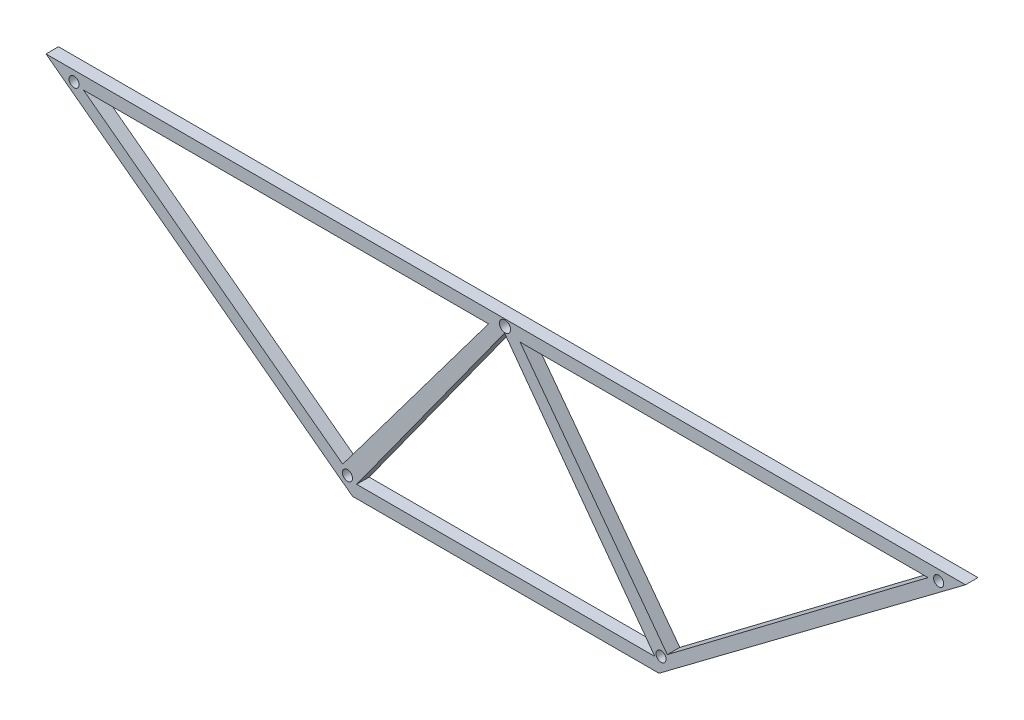
ISO-10303-21;
HEADER;
FILE_DESCRIPTION(('STEP AP214'),'2;1');
FILE_NAME('part.step','',(''),(''),'','','');
FILE_SCHEMA(('AUTOMOTIVE_DESIGN { 1 0 10303 214 1 1 1 1 }'));
ENDSEC;
DATA;
#1=APPLICATION_CONTEXT('core data for automotive mechanical design processes');
#2=APPLICATION_PROTOCOL_DEFINITION('international standard','automotive_design',2000,#1);
#3=PRODUCT_CONTEXT('',#1,'mechanical');
#4=PRODUCT('Part','Part','',(#3));
#5=PRODUCT_RELATED_PRODUCT_CATEGORY('part','',(#4));
#6=PRODUCT_DEFINITION_FORMATION('','',#4);
#7=PRODUCT_DEFINITION_CONTEXT('part definition',#1,'design');
#8=PRODUCT_DEFINITION('design','',#6,#7);
#9=PRODUCT_DEFINITION_SHAPE('','',#8);
#10=(LENGTH_UNIT() NAMED_UNIT(*) SI_UNIT(.MILLI.,.METRE.));
#11=(NAMED_UNIT(*) PLANE_ANGLE_UNIT() SI_UNIT($,.RADIAN.));
#12=(NAMED_UNIT(*) SI_UNIT($,.STERADIAN.) SOLID_ANGLE_UNIT());
#13=UNCERTAINTY_MEASURE_WITH_UNIT(LENGTH_MEASURE(1.E-05),#10,'distance_accuracy_value','');
#14=(GEOMETRIC_REPRESENTATION_CONTEXT(3) GLOBAL_UNCERTAINTY_ASSIGNED_CONTEXT((#13)) GLOBAL_UNIT_ASSIGNED_CONTEXT((#10,
#11,#12)) REPRESENTATION_CONTEXT('',''));
#15=CARTESIAN_POINT('',(0.,0.,0.));
#16=DIRECTION('',(0.,0.,1.));
#17=DIRECTION('',(1.,0.,0.));
#18=AXIS2_PLACEMENT_3D('',#15,#16,#17);
#19=CARTESIAN_POINT('',(-800.,300.,-16.31));
#20=DIRECTION('',(-0.6,-0.8,0.));
#21=DIRECTION('',(0.8,-0.6,0.));
#22=AXIS2_PLACEMENT_3D('',#19,#20,#21);
#23=PLANE('',#22);
#24=DIRECTION('',(0.8,-0.6,0.));
#25=VECTOR('',#24,1.);
#26=CARTESIAN_POINT('',(-800.,300.,0.));
#27=LINE('',#26,#25);
#28=CARTESIAN_POINT('',(-800.,300.,0.));
#29=VERTEX_POINT('',#28);
#30=CARTESIAN_POINT('',(-400.,0.,0.));
#31=VERTEX_POINT('',#30);
#32=EDGE_CURVE('E237',#29,#31,#27,.T.);
#33=ORIENTED_EDGE('',*,*,#32,.F.);
#34=DIRECTION('',(0.,0.,1.));
#35=VECTOR('',#34,1.);
#36=CARTESIAN_POINT('',(-800.,300.,-16.31));
#37=LINE('',#36,#35);
#38=CARTESIAN_POINT('',(-800.,300.,-16.31));
#39=VERTEX_POINT('',#38);
#40=EDGE_CURVE('E11',#39,#29,#37,.T.);
#41=ORIENTED_EDGE('',*,*,#40,.F.);
#42=DIRECTION('',(0.8,-0.6,0.));
#43=VECTOR('',#42,1.);
#44=CARTESIAN_POINT('',(-800.,300.,-16.31));
#45=LINE('',#44,#43);
#46=CARTESIAN_POINT('',(-400.,0.,-16.31));
#47=VERTEX_POINT('',#46);
#48=EDGE_CURVE('E244',#39,#47,#45,.T.);
#49=ORIENTED_EDGE('',*,*,#48,.T.);
#50=DIRECTION('',(0.,0.,1.));
#51=VECTOR('',#50,1.);
#52=CARTESIAN_POINT('',(-400.,0.,-16.31));
#53=LINE('',#52,#51);
#54=EDGE_CURVE('E47',#47,#31,#53,.T.);
#55=ORIENTED_EDGE('',*,*,#54,.T.);
#56=EDGE_LOOP('',(#33,#41,#49,#55));
#57=FACE_BOUND('',#56,.T.);
#58=ADVANCED_FACE('F44',(#57),#23,.T.);
#59=CARTESIAN_POINT('',(-800.,300.,-16.31));
#60=DIRECTION('',(0.,1.,0.));
#61=DIRECTION('',(-1.,0.,0.));
#62=AXIS2_PLACEMENT_3D('',#59,#60,#61);
#63=PLANE('',#62);
#64=DIRECTION('',(-1.,0.,0.));
#65=VECTOR('',#64,1.);
#66=CARTESIAN_POINT('',(-800.,300.,0.));
#67=LINE('',#66,#65);
#68=CARTESIAN_POINT('',(400.,300.,0.));
#69=VERTEX_POINT('',#68);
#70=EDGE_CURVE('E249',#69,#29,#67,.T.);
#71=ORIENTED_EDGE('',*,*,#70,.F.);
#72=DIRECTION('',(0.,0.,1.));
#73=VECTOR('',#72,1.);
#74=CARTESIAN_POINT('',(400.,300.,-16.31));
#75=LINE('',#74,#73);
#76=CARTESIAN_POINT('',(400.,300.,-16.31));
#77=VERTEX_POINT('',#76);
#78=EDGE_CURVE('E53',#77,#69,#75,.T.);
#79=ORIENTED_EDGE('',*,*,#78,.F.);
#80=DIRECTION('',(-1.,0.,0.));
#81=VECTOR('',#80,1.);
#82=CARTESIAN_POINT('',(-800.,300.,-16.31));
#83=LINE('',#82,#81);
#84=EDGE_CURVE('E257',#77,#39,#83,.T.);
#85=ORIENTED_EDGE('',*,*,#84,.T.);
#86=ORIENTED_EDGE('',*,*,#40,.T.);
#87=EDGE_LOOP('',(#71,#79,#85,#86));
#88=FACE_BOUND('',#87,.T.);
#89=ADVANCED_FACE('F290',(#88),#63,.T.);
#90=CARTESIAN_POINT('',(0.,0.,-16.31));
#91=DIRECTION('',(0.6,-0.8,0.));
#92=DIRECTION('',(0.8,0.6,0.));
#93=AXIS2_PLACEMENT_3D('',#90,#91,#92);
#94=PLANE('',#93);
#95=DIRECTION('',(0.8,0.6,0.));
#96=VECTOR('',#95,1.);
#97=CARTESIAN_POINT('',(0.,0.,0.));
#98=LINE('',#97,#96);
#99=CARTESIAN_POINT('',(0.,0.,0.));
#100=VERTEX_POINT('',#99);
#101=EDGE_CURVE('E268',#100,#69,#98,.T.);
#102=ORIENTED_EDGE('',*,*,#101,.F.);
#103=DIRECTION('',(0.,0.,1.));
#104=VECTOR('',#103,1.);
#105=CARTESIAN_POINT('',(0.,0.,-16.31));
#106=LINE('',#105,#104);
#107=CARTESIAN_POINT('',(0.,0.,-16.31));
#108=VERTEX_POINT('',#107);
#109=EDGE_CURVE('E276',#108,#100,#106,.T.);
#110=ORIENTED_EDGE('',*,*,#109,.F.);
#111=DIRECTION('',(0.8,0.6,0.));
#112=VECTOR('',#111,1.);
#113=CARTESIAN_POINT('',(0.,0.,-16.31));
#114=LINE('',#113,#112);
#115=EDGE_CURVE('E253',#108,#77,#114,.T.);
#116=ORIENTED_EDGE('',*,*,#115,.T.);
#117=ORIENTED_EDGE('',*,*,#78,.T.);
#118=EDGE_LOOP('',(#102,#110,#116,#117));
#119=FACE_BOUND('',#118,.T.);
#120=ADVANCED_FACE('F296',(#119),#94,.T.);
#121=CARTESIAN_POINT('',(0.,0.,-16.31));
#122=DIRECTION('',(0.,-1.,0.));
#123=DIRECTION('',(1.,0.,0.));
#124=AXIS2_PLACEMENT_3D('',#121,#122,#123);
#125=PLANE('',#124);
#126=DIRECTION('',(1.,0.,0.));
#127=VECTOR('',#126,1.);
#128=CARTESIAN_POINT('',(0.,0.,0.));
#129=LINE('',#128,#127);
#130=EDGE_CURVE('E264',#31,#100,#129,.T.);
#131=ORIENTED_EDGE('',*,*,#130,.F.);
#132=ORIENTED_EDGE('',*,*,#54,.F.);
#133=DIRECTION('',(1.,0.,0.));
#134=VECTOR('',#133,1.);
#135=CARTESIAN_POINT('',(0.,0.,-16.31));
#136=LINE('',#135,#134);
#137=EDGE_CURVE('E248',#47,#108,#136,.T.);
#138=ORIENTED_EDGE('',*,*,#137,.T.);
#139=ORIENTED_EDGE('',*,*,#109,.T.);
#140=EDGE_LOOP('',(#131,#132,#138,#139));
#141=FACE_BOUND('',#140,.T.);
#142=ADVANCED_FACE('F286',(#141),#125,.T.);
#143=CARTESIAN_POINT('',(0.,0.,-16.31));
#144=DIRECTION('',(0.,0.,1.));
#145=DIRECTION('',(1.,0.,0.));
#146=AXIS2_PLACEMENT_3D('',#143,#144,#145);
#147=PLANE('',#146);
#148=CARTESIAN_POINT('',(-406.577807344166,20.3731890483728,-16.31));
#149=DIRECTION('',(0.,0.,1.));
#150=DIRECTION('',(1.,0.,0.));
#151=AXIS2_PLACEMENT_3D('',#148,#149,#150);
#152=CIRCLE('',#151,6.60000000000001);
#153=CARTESIAN_POINT('',(-399.977807344166,20.3731890483728,-16.31));
#154=VERTEX_POINT('',#153);
#155=EDGE_CURVE('E181',#154,#154,#152,.T.);
#156=ORIENTED_EDGE('',*,*,#155,.T.);
#157=EDGE_LOOP('',(#156));
#158=FACE_BOUND('',#157,.T.);
#159=CARTESIAN_POINT('',(2.61334070824559,20.3731890483728,-16.31));
#160=DIRECTION('',(0.,0.,1.));
#161=DIRECTION('',(1.,0.,0.));
#162=AXIS2_PLACEMENT_3D('',#159,#160,#161);
#163=CIRCLE('',#162,6.6);
#164=CARTESIAN_POINT('',(9.21334070824559,20.3731890483728,-16.31));
#165=VERTEX_POINT('',#164);
#166=EDGE_CURVE('E486',#165,#165,#163,.T.);
#167=ORIENTED_EDGE('',*,*,#166,.T.);
#168=EDGE_LOOP('',(#167));
#169=FACE_BOUND('',#168,.T.);
#170=CARTESIAN_POINT('',(364.965045825421,286.770824774054,-16.31));
#171=DIRECTION('',(0.,0.,1.));
#172=DIRECTION('',(1.,0.,0.));
#173=AXIS2_PLACEMENT_3D('',#170,#171,#172);
#174=CIRCLE('',#173,6.60000000000001);
#175=CARTESIAN_POINT('',(371.565045825421,286.770824774054,-16.31));
#176=VERTEX_POINT('',#175);
#177=EDGE_CURVE('E490',#176,#176,#174,.T.);
#178=ORIENTED_EDGE('',*,*,#177,.T.);
#179=EDGE_LOOP('',(#178));
#180=FACE_BOUND('',#179,.T.);
#181=CARTESIAN_POINT('',(-763.369850401914,286.770824774054,-16.31));
#182=DIRECTION('',(0.,0.,1.));
#183=DIRECTION('',(1.,0.,0.));
#184=AXIS2_PLACEMENT_3D('',#181,#182,#183);
#185=CIRCLE('',#184,6.60000000000006);
#186=CARTESIAN_POINT('',(-756.769850401914,286.770824774054,-16.31));
#187=VERTEX_POINT('',#186);
#188=EDGE_CURVE('E513',#187,#187,#185,.T.);
#189=ORIENTED_EDGE('',*,*,#188,.T.);
#190=EDGE_LOOP('',(#189));
#191=FACE_BOUND('',#190,.T.);
#192=CARTESIAN_POINT('',(-200.996317691442,291.556411044575,-16.31));
#193=DIRECTION('',(0.,0.,1.));
#194=DIRECTION('',(1.,0.,0.));
#195=AXIS2_PLACEMENT_3D('',#192,#193,#194);
#196=CIRCLE('',#195,7.31600606936046);
#197=CARTESIAN_POINT('',(-193.680311622082,291.556411044575,-16.31));
#198=VERTEX_POINT('',#197);
#199=EDGE_CURVE('E517',#198,#198,#196,.T.);
#200=ORIENTED_EDGE('',*,*,#199,.T.);
#201=EDGE_LOOP('',(#200));
#202=FACE_BOUND('',#201,.T.);
#203=DIRECTION('',(1.,0.,0.));
#204=VECTOR('',#203,1.);
#205=CARTESIAN_POINT('',(0.,283.69,-16.31));
#206=LINE('',#205,#204);
#207=CARTESIAN_POINT('',(-181.302021640247,283.69,-16.31));
#208=VERTEX_POINT('',#207);
#209=CARTESIAN_POINT('',(351.07,283.69,-16.31));
#210=VERTEX_POINT('',#209);
#211=EDGE_CURVE('E145',#208,#210,#206,.T.);
#212=ORIENTED_EDGE('',*,*,#211,.F.);
#213=DIRECTION('',(0.598638574619455,-0.80101926130249,0.));
#214=VECTOR('',#213,1.);
#215=CARTESIAN_POINT('',(19.7061678496349,14.7273265483466,-16.31));
#216=LINE('',#215,#214);
#217=CARTESIAN_POINT('',(10.8733333333333,26.5462618449112,-16.31));
#218=VERTEX_POINT('',#217);
#219=EDGE_CURVE('E206',#208,#218,#216,.T.);
#220=ORIENTED_EDGE('',*,*,#219,.T.);
#221=DIRECTION('',(0.797747463311023,0.602991695449306,0.));
#222=VECTOR('',#221,1.);
#223=CARTESIAN_POINT('',(-8.81615063901956,11.6636130505996,-16.31));
#224=LINE('',#223,#222);
#225=EDGE_CURVE('E201',#218,#210,#224,.T.);
#226=ORIENTED_EDGE('',*,*,#225,.T.);
#227=EDGE_LOOP('',(#212,#220,#226));
#228=FACE_BOUND('',#227,.T.);
#229=DIRECTION('',(1.,0.,0.));
#230=VECTOR('',#229,1.);
#231=CARTESIAN_POINT('',(0.,283.69,-16.31));
#232=LINE('',#231,#230);
#233=CARTESIAN_POINT('',(-751.07,283.69,-16.31));
#234=VERTEX_POINT('',#233);
#235=CARTESIAN_POINT('',(-222.4886761837,283.69,-16.31));
#236=VERTEX_POINT('',#235);
#237=EDGE_CURVE('E194',#234,#236,#232,.T.);
#238=ORIENTED_EDGE('',*,*,#237,.F.);
#239=DIRECTION('',(0.8,-0.6,0.));
#240=VECTOR('',#239,1.);
#241=CARTESIAN_POINT('',(-134.214,-178.952,-16.31));
#242=LINE('',#241,#240);
#243=CARTESIAN_POINT('',(-412.777952757568,29.9709645681759,-16.31));
#244=VERTEX_POINT('',#243);
#245=EDGE_CURVE('E197',#234,#244,#242,.T.);
#246=ORIENTED_EDGE('',*,*,#245,.T.);
#247=DIRECTION('',(-0.6,-0.8,0.));
#248=VECTOR('',#247,1.);
#249=CARTESIAN_POINT('',(-278.563952757568,208.922964568176,-16.31));
#250=LINE('',#249,#248);
#251=EDGE_CURVE('E169',#236,#244,#250,.T.);
#252=ORIENTED_EDGE('',*,*,#251,.F.);
#253=EDGE_LOOP('',(#238,#246,#252));
#254=FACE_BOUND('',#253,.T.);
#255=DIRECTION('',(-0.591388602230555,0.806386706953798,0.));
#256=VECTOR('',#255,1.);
#257=CARTESIAN_POINT('',(-5.43666666666673,16.3099999999999,-16.31));
#258=LINE('',#257,#256);
#259=CARTESIAN_POINT('',(-5.43666666666673,16.3099999999999,-16.31));
#260=VERTEX_POINT('',#259);
#261=CARTESIAN_POINT('',(-201.528049499278,283.69,-16.31));
#262=VERTEX_POINT('',#261);
#263=EDGE_CURVE('E220',#260,#262,#258,.T.);
#264=ORIENTED_EDGE('',*,*,#263,.T.);
#265=DIRECTION('',(-0.585346075160544,-0.810783554528671,0.));
#266=VECTOR('',#265,1.);
#267=CARTESIAN_POINT('',(-201.528049499278,283.69,-16.31));
#268=LINE('',#267,#266);
#269=CARTESIAN_POINT('',(-394.563333333333,16.3099999999999,-16.31));
#270=VERTEX_POINT('',#269);
#271=EDGE_CURVE('E211',#262,#270,#268,.T.);
#272=ORIENTED_EDGE('',*,*,#271,.T.);
#273=DIRECTION('',(1.,0.,0.));
#274=VECTOR('',#273,1.);
#275=CARTESIAN_POINT('',(-394.563333333333,16.3099999999999,-16.31));
#276=LINE('',#275,#274);
#277=EDGE_CURVE('E215',#270,#260,#276,.T.);
#278=ORIENTED_EDGE('',*,*,#277,.T.);
#279=EDGE_LOOP('',(#264,#272,#278));
#280=FACE_BOUND('',#279,.T.);
#281=ORIENTED_EDGE('',*,*,#48,.F.);
#282=ORIENTED_EDGE('',*,*,#84,.F.);
#283=ORIENTED_EDGE('',*,*,#115,.F.);
#284=ORIENTED_EDGE('',*,*,#137,.F.);
#285=EDGE_LOOP('',(#281,#282,#283,#284));
#286=FACE_BOUND('',#285,.T.);
#287=ADVANCED_FACE('F293',(#158,#169,#180,#191,#202,#228,#254,#280,#286),#147,.F.);
#288=CARTESIAN_POINT('',(0.,0.,0.));
#289=DIRECTION('',(0.,0.,1.));
#290=DIRECTION('',(1.,0.,0.));
#291=AXIS2_PLACEMENT_3D('',#288,#289,#290);
#292=PLANE('',#291);
#293=CARTESIAN_POINT('',(-406.577807344166,20.3731890483728,0.));
#294=DIRECTION('',(0.,0.,1.));
#295=DIRECTION('',(1.,0.,0.));
#296=AXIS2_PLACEMENT_3D('',#293,#294,#295);
#297=CIRCLE('',#296,6.60000000000001);
#298=CARTESIAN_POINT('',(-399.977807344166,20.3731890483728,0.));
#299=VERTEX_POINT('',#298);
#300=EDGE_CURVE('E482',#299,#299,#297,.T.);
#301=ORIENTED_EDGE('',*,*,#300,.F.);
#302=EDGE_LOOP('',(#301));
#303=FACE_BOUND('',#302,.T.);
#304=CARTESIAN_POINT('',(2.61334070824559,20.3731890483728,0.));
#305=DIRECTION('',(0.,0.,1.));
#306=DIRECTION('',(1.,0.,0.));
#307=AXIS2_PLACEMENT_3D('',#304,#305,#306);
#308=CIRCLE('',#307,6.6);
#309=CARTESIAN_POINT('',(9.21334070824559,20.3731890483728,0.));
#310=VERTEX_POINT('',#309);
#311=EDGE_CURVE('E528',#310,#310,#308,.T.);
#312=ORIENTED_EDGE('',*,*,#311,.F.);
#313=EDGE_LOOP('',(#312));
#314=FACE_BOUND('',#313,.T.);
#315=CARTESIAN_POINT('',(364.965045825421,286.770824774054,0.));
#316=DIRECTION('',(0.,0.,1.));
#317=DIRECTION('',(1.,0.,0.));
#318=AXIS2_PLACEMENT_3D('',#315,#316,#317);
#319=CIRCLE('',#318,6.60000000000001);
#320=CARTESIAN_POINT('',(371.565045825421,286.770824774054,0.));
#321=VERTEX_POINT('',#320);
#322=EDGE_CURVE('E532',#321,#321,#319,.T.);
#323=ORIENTED_EDGE('',*,*,#322,.F.);
#324=EDGE_LOOP('',(#323));
#325=FACE_BOUND('',#324,.T.);
#326=CARTESIAN_POINT('',(-763.369850401914,286.770824774054,0.));
#327=DIRECTION('',(0.,0.,1.));
#328=DIRECTION('',(1.,0.,0.));
#329=AXIS2_PLACEMENT_3D('',#326,#327,#328);
#330=CIRCLE('',#329,6.60000000000006);
#331=CARTESIAN_POINT('',(-756.769850401914,286.770824774054,0.));
#332=VERTEX_POINT('',#331);
#333=EDGE_CURVE('E525',#332,#332,#330,.T.);
#334=ORIENTED_EDGE('',*,*,#333,.F.);
#335=EDGE_LOOP('',(#334));
#336=FACE_BOUND('',#335,.T.);
#337=CARTESIAN_POINT('',(-200.996317691442,291.556411044575,0.));
#338=DIRECTION('',(0.,0.,1.));
#339=DIRECTION('',(1.,0.,0.));
#340=AXIS2_PLACEMENT_3D('',#337,#338,#339);
#341=CIRCLE('',#340,7.31600606936046);
#342=CARTESIAN_POINT('',(-193.680311622082,291.556411044575,0.));
#343=VERTEX_POINT('',#342);
#344=EDGE_CURVE('E521',#343,#343,#341,.T.);
#345=ORIENTED_EDGE('',*,*,#344,.F.);
#346=EDGE_LOOP('',(#345));
#347=FACE_BOUND('',#346,.T.);
#348=DIRECTION('',(0.598638574619455,-0.80101926130249,0.));
#349=VECTOR('',#348,1.);
#350=CARTESIAN_POINT('',(19.7061678496349,14.7273265483466,0.));
#351=LINE('',#350,#349);
#352=CARTESIAN_POINT('',(-181.302021640247,283.69,0.));
#353=VERTEX_POINT('',#352);
#354=CARTESIAN_POINT('',(10.8733333333333,26.5462618449113,0.));
#355=VERTEX_POINT('',#354);
#356=EDGE_CURVE('E158',#353,#355,#351,.T.);
#357=ORIENTED_EDGE('',*,*,#356,.F.);
#358=DIRECTION('',(1.,0.,0.));
#359=VECTOR('',#358,1.);
#360=CARTESIAN_POINT('',(0.,283.69,0.));
#361=LINE('',#360,#359);
#362=CARTESIAN_POINT('',(351.07,283.69,0.));
#363=VERTEX_POINT('',#362);
#364=EDGE_CURVE('E142',#353,#363,#361,.T.);
#365=ORIENTED_EDGE('',*,*,#364,.T.);
#366=DIRECTION('',(0.797747463311023,0.602991695449306,0.));
#367=VECTOR('',#366,1.);
#368=CARTESIAN_POINT('',(-8.81615063901956,11.6636130505996,0.));
#369=LINE('',#368,#367);
#370=EDGE_CURVE('E153',#355,#363,#369,.T.);
#371=ORIENTED_EDGE('',*,*,#370,.F.);
#372=EDGE_LOOP('',(#357,#365,#371));
#373=FACE_BOUND('',#372,.T.);
#374=DIRECTION('',(0.8,-0.6,0.));
#375=VECTOR('',#374,1.);
#376=CARTESIAN_POINT('',(-751.07,283.69,0.));
#377=LINE('',#376,#375);
#378=CARTESIAN_POINT('',(-751.07,283.69,0.));
#379=VERTEX_POINT('',#378);
#380=CARTESIAN_POINT('',(-412.777952757568,29.9709645681759,0.));
#381=VERTEX_POINT('',#380);
#382=EDGE_CURVE('E189',#379,#381,#377,.T.);
#383=ORIENTED_EDGE('',*,*,#382,.F.);
#384=DIRECTION('',(1.,0.,0.));
#385=VECTOR('',#384,1.);
#386=CARTESIAN_POINT('',(-751.07,283.69,0.));
#387=LINE('',#386,#385);
#388=CARTESIAN_POINT('',(-222.4886761837,283.69,0.));
#389=VERTEX_POINT('',#388);
#390=EDGE_CURVE('E175',#379,#389,#387,.T.);
#391=ORIENTED_EDGE('',*,*,#390,.T.);
#392=DIRECTION('',(-0.6,-0.8,0.));
#393=VECTOR('',#392,1.);
#394=CARTESIAN_POINT('',(-222.4886761837,283.69,0.));
#395=LINE('',#394,#393);
#396=EDGE_CURVE('E185',#389,#381,#395,.T.);
#397=ORIENTED_EDGE('',*,*,#396,.T.);
#398=EDGE_LOOP('',(#383,#391,#397));
#399=FACE_BOUND('',#398,.T.);
#400=DIRECTION('',(-0.585346075160544,-0.810783554528671,0.));
#401=VECTOR('',#400,1.);
#402=CARTESIAN_POINT('',(-201.528049499278,283.69,0.));
#403=LINE('',#402,#401);
#404=CARTESIAN_POINT('',(-201.528049499278,283.69,0.));
#405=VERTEX_POINT('',#404);
#406=CARTESIAN_POINT('',(-394.563333333333,16.3099999999999,0.));
#407=VERTEX_POINT('',#406);
#408=EDGE_CURVE('E210',#405,#407,#403,.T.);
#409=ORIENTED_EDGE('',*,*,#408,.F.);
#410=DIRECTION('',(-0.591388602230555,0.806386706953798,0.));
#411=VECTOR('',#410,1.);
#412=CARTESIAN_POINT('',(-5.43666666666673,16.3099999999999,0.));
#413=LINE('',#412,#411);
#414=CARTESIAN_POINT('',(-5.43666666666673,16.3099999999999,0.));
#415=VERTEX_POINT('',#414);
#416=EDGE_CURVE('E216',#415,#405,#413,.T.);
#417=ORIENTED_EDGE('',*,*,#416,.F.);
#418=DIRECTION('',(1.,0.,0.));
#419=VECTOR('',#418,1.);
#420=CARTESIAN_POINT('',(-394.563333333333,16.3099999999999,0.));
#421=LINE('',#420,#419);
#422=EDGE_CURVE('E227',#407,#415,#421,.T.);
#423=ORIENTED_EDGE('',*,*,#422,.F.);
#424=EDGE_LOOP('',(#409,#417,#423));
#425=FACE_BOUND('',#424,.T.);
#426=ORIENTED_EDGE('',*,*,#32,.T.);
#427=ORIENTED_EDGE('',*,*,#130,.T.);
#428=ORIENTED_EDGE('',*,*,#101,.T.);
#429=ORIENTED_EDGE('',*,*,#70,.T.);
#430=EDGE_LOOP('',(#426,#427,#428,#429));
#431=FACE_BOUND('',#430,.T.);
#432=ADVANCED_FACE('F160',(#303,#314,#325,#336,#347,#373,#399,#425,#431),#292,.T.);
#433=CARTESIAN_POINT('',(-201.528049499278,283.69,-16.31));
#434=DIRECTION('',(-0.810783554528671,0.585346075160544,0.));
#435=DIRECTION('',(-0.585346075160544,-0.810783554528671,0.));
#436=AXIS2_PLACEMENT_3D('',#433,#434,#435);
#437=PLANE('',#436);
#438=ORIENTED_EDGE('',*,*,#408,.T.);
#439=DIRECTION('',(0.,0.,1.));
#440=VECTOR('',#439,1.);
#441=CARTESIAN_POINT('',(-394.563333333333,16.3099999999999,-16.31));
#442=LINE('',#441,#440);
#443=EDGE_CURVE('E224',#270,#407,#442,.T.);
#444=ORIENTED_EDGE('',*,*,#443,.F.);
#445=ORIENTED_EDGE('',*,*,#271,.F.);
#446=DIRECTION('',(0.,0.,1.));
#447=VECTOR('',#446,1.);
#448=CARTESIAN_POINT('',(-201.528049499278,283.69,-16.31));
#449=LINE('',#448,#447);
#450=EDGE_CURVE('E234',#262,#405,#449,.T.);
#451=ORIENTED_EDGE('',*,*,#450,.T.);
#452=EDGE_LOOP('',(#438,#444,#445,#451));
#453=FACE_BOUND('',#452,.T.);
#454=ADVANCED_FACE('F343',(#453),#437,.F.);
#455=CARTESIAN_POINT('',(-5.43666666666673,16.3099999999999,-16.31));
#456=DIRECTION('',(0.806386706953798,0.591388602230555,0.));
#457=DIRECTION('',(-0.591388602230555,0.806386706953798,0.));
#458=AXIS2_PLACEMENT_3D('',#455,#456,#457);
#459=PLANE('',#458);
#460=ORIENTED_EDGE('',*,*,#416,.T.);
#461=ORIENTED_EDGE('',*,*,#450,.F.);
#462=ORIENTED_EDGE('',*,*,#263,.F.);
#463=DIRECTION('',(0.,0.,1.));
#464=VECTOR('',#463,1.);
#465=CARTESIAN_POINT('',(-5.43666666666673,16.3099999999999,-16.31));
#466=LINE('',#465,#464);
#467=EDGE_CURVE('E238',#260,#415,#466,.T.);
#468=ORIENTED_EDGE('',*,*,#467,.T.);
#469=EDGE_LOOP('',(#460,#461,#462,#468));
#470=FACE_BOUND('',#469,.T.);
#471=ADVANCED_FACE('F353',(#470),#459,.F.);
#472=CARTESIAN_POINT('',(-394.563333333333,16.3099999999999,-16.31));
#473=DIRECTION('',(0.,-1.,0.));
#474=DIRECTION('',(1.,0.,0.));
#475=AXIS2_PLACEMENT_3D('',#472,#473,#474);
#476=PLANE('',#475);
#477=ORIENTED_EDGE('',*,*,#422,.T.);
#478=ORIENTED_EDGE('',*,*,#467,.F.);
#479=ORIENTED_EDGE('',*,*,#277,.F.);
#480=ORIENTED_EDGE('',*,*,#443,.T.);
#481=EDGE_LOOP('',(#477,#478,#479,#480));
#482=FACE_BOUND('',#481,.T.);
#483=ADVANCED_FACE('F363',(#482),#476,.F.);
#484=CARTESIAN_POINT('',(-751.07,283.69,-130.31));
#485=DIRECTION('',(-0.6,-0.8,0.));
#486=DIRECTION('',(0.8,-0.6,0.));
#487=AXIS2_PLACEMENT_3D('',#484,#485,#486);
#488=PLANE('',#487);
#489=DIRECTION('',(0.,0.,1.));
#490=VECTOR('',#489,1.);
#491=CARTESIAN_POINT('',(-751.07,283.69,-130.31));
#492=LINE('',#491,#490);
#493=EDGE_CURVE('E178',#234,#379,#492,.T.);
#494=ORIENTED_EDGE('',*,*,#493,.T.);
#495=ORIENTED_EDGE('',*,*,#382,.T.);
#496=DIRECTION('',(0.,0.,1.));
#497=VECTOR('',#496,1.);
#498=CARTESIAN_POINT('',(-412.777952757568,29.9709645681759,-130.31));
#499=LINE('',#498,#497);
#500=EDGE_CURVE('E171',#244,#381,#499,.T.);
#501=ORIENTED_EDGE('',*,*,#500,.F.);
#502=ORIENTED_EDGE('',*,*,#245,.F.);
#503=EDGE_LOOP('',(#494,#495,#501,#502));
#504=FACE_BOUND('',#503,.T.);
#505=ADVANCED_FACE('F373',(#504),#488,.F.);
#506=CARTESIAN_POINT('',(-751.07,283.69,-130.31));
#507=DIRECTION('',(0.,-1.,0.));
#508=DIRECTION('',(0.,0.,-1.));
#509=AXIS2_PLACEMENT_3D('',#506,#507,#508);
#510=PLANE('',#509);
#511=ORIENTED_EDGE('',*,*,#237,.T.);
#512=DIRECTION('',(0.,0.,1.));
#513=VECTOR('',#512,1.);
#514=CARTESIAN_POINT('',(-222.4886761837,283.69,-130.31));
#515=LINE('',#514,#513);
#516=EDGE_CURVE('E69',#236,#389,#515,.T.);
#517=ORIENTED_EDGE('',*,*,#516,.T.);
#518=ORIENTED_EDGE('',*,*,#390,.F.);
#519=ORIENTED_EDGE('',*,*,#493,.F.);
#520=EDGE_LOOP('',(#511,#517,#518,#519));
#521=FACE_BOUND('',#520,.T.);
#522=ADVANCED_FACE('F383',(#521),#510,.T.);
#523=CARTESIAN_POINT('',(-222.4886761837,283.69,-130.31));
#524=DIRECTION('',(-0.8,0.6,0.));
#525=DIRECTION('',(-0.6,-0.8,0.));
#526=AXIS2_PLACEMENT_3D('',#523,#524,#525);
#527=PLANE('',#526);
#528=ORIENTED_EDGE('',*,*,#251,.T.);
#529=ORIENTED_EDGE('',*,*,#500,.T.);
#530=ORIENTED_EDGE('',*,*,#396,.F.);
#531=ORIENTED_EDGE('',*,*,#516,.F.);
#532=EDGE_LOOP('',(#528,#529,#530,#531));
#533=FACE_BOUND('',#532,.T.);
#534=ADVANCED_FACE('F393',(#533),#527,.T.);
#535=CARTESIAN_POINT('',(19.7061678496349,14.7273265483466,-130.31));
#536=DIRECTION('',(-0.80101926130249,-0.598638574619455,0.));
#537=DIRECTION('',(0.598638574619455,-0.80101926130249,0.));
#538=AXIS2_PLACEMENT_3D('',#535,#536,#537);
#539=PLANE('',#538);
#540=DIRECTION('',(0.,0.,1.));
#541=VECTOR('',#540,1.);
#542=CARTESIAN_POINT('',(-181.302021640247,283.69,-130.31));
#543=LINE('',#542,#541);
#544=EDGE_CURVE('E148',#208,#353,#543,.T.);
#545=ORIENTED_EDGE('',*,*,#544,.T.);
#546=ORIENTED_EDGE('',*,*,#356,.T.);
#547=DIRECTION('',(0.,0.,1.));
#548=VECTOR('',#547,1.);
#549=CARTESIAN_POINT('',(10.8733333333333,26.5462618449112,-130.31));
#550=LINE('',#549,#548);
#551=EDGE_CURVE('E149',#218,#355,#550,.T.);
#552=ORIENTED_EDGE('',*,*,#551,.F.);
#553=ORIENTED_EDGE('',*,*,#219,.F.);
#554=EDGE_LOOP('',(#545,#546,#552,#553));
#555=FACE_BOUND('',#554,.T.);
#556=ADVANCED_FACE('F403',(#555),#539,.F.);
#557=CARTESIAN_POINT('',(0.,283.69,-130.31));
#558=DIRECTION('',(0.,-1.,0.));
#559=DIRECTION('',(0.,0.,-1.));
#560=AXIS2_PLACEMENT_3D('',#557,#558,#559);
#561=PLANE('',#560);
#562=ORIENTED_EDGE('',*,*,#211,.T.);
#563=DIRECTION('',(0.,0.,1.));
#564=VECTOR('',#563,1.);
#565=CARTESIAN_POINT('',(351.07,283.69,-130.31));
#566=LINE('',#565,#564);
#567=EDGE_CURVE('E61',#210,#363,#566,.T.);
#568=ORIENTED_EDGE('',*,*,#567,.T.);
#569=ORIENTED_EDGE('',*,*,#364,.F.);
#570=ORIENTED_EDGE('',*,*,#544,.F.);
#571=EDGE_LOOP('',(#562,#568,#569,#570));
#572=FACE_BOUND('',#571,.T.);
#573=ADVANCED_FACE('F139',(#572),#561,.T.);
#574=CARTESIAN_POINT('',(-8.81615063901956,11.6636130505996,-130.31));
#575=DIRECTION('',(0.602991695449306,-0.797747463311023,0.));
#576=DIRECTION('',(0.797747463311023,0.602991695449306,0.));
#577=AXIS2_PLACEMENT_3D('',#574,#575,#576);
#578=PLANE('',#577);
#579=ORIENTED_EDGE('',*,*,#551,.T.);
#580=ORIENTED_EDGE('',*,*,#370,.T.);
#581=ORIENTED_EDGE('',*,*,#567,.F.);
#582=ORIENTED_EDGE('',*,*,#225,.F.);
#583=EDGE_LOOP('',(#579,#580,#581,#582));
#584=FACE_BOUND('',#583,.T.);
#585=ADVANCED_FACE('F154',(#584),#578,.F.);
#586=CARTESIAN_POINT('',(-200.996317691442,291.556411044575,-130.31));
#587=DIRECTION('',(0.,0.,1.));
#588=DIRECTION('',(1.,0.,0.));
#589=AXIS2_PLACEMENT_3D('',#586,#587,#588);
#590=CYLINDRICAL_SURFACE('',#589,7.31600606936046);
#591=ORIENTED_EDGE('',*,*,#344,.T.);
#592=EDGE_LOOP('',(#591));
#593=FACE_BOUND('',#592,.T.);
#594=ORIENTED_EDGE('',*,*,#199,.F.);
#595=EDGE_LOOP('',(#594));
#596=FACE_BOUND('',#595,.T.);
#597=ADVANCED_FACE('F428',(#593,#596),#590,.F.);
#598=CARTESIAN_POINT('',(-763.369850401914,286.770824774054,-130.31));
#599=DIRECTION('',(0.,0.,1.));
#600=DIRECTION('',(1.,0.,0.));
#601=AXIS2_PLACEMENT_3D('',#598,#599,#600);
#602=CYLINDRICAL_SURFACE('',#601,6.60000000000006);
#603=ORIENTED_EDGE('',*,*,#333,.T.);
#604=EDGE_LOOP('',(#603));
#605=FACE_BOUND('',#604,.T.);
#606=ORIENTED_EDGE('',*,*,#188,.F.);
#607=EDGE_LOOP('',(#606));
#608=FACE_BOUND('',#607,.T.);
#609=ADVANCED_FACE('F436',(#605,#608),#602,.F.);
#610=CARTESIAN_POINT('',(364.965045825421,286.770824774054,-130.31));
#611=DIRECTION('',(0.,0.,1.));
#612=DIRECTION('',(1.,0.,0.));
#613=AXIS2_PLACEMENT_3D('',#610,#611,#612);
#614=CYLINDRICAL_SURFACE('',#613,6.60000000000001);
#615=ORIENTED_EDGE('',*,*,#322,.T.);
#616=EDGE_LOOP('',(#615));
#617=FACE_BOUND('',#616,.T.);
#618=ORIENTED_EDGE('',*,*,#177,.F.);
#619=EDGE_LOOP('',(#618));
#620=FACE_BOUND('',#619,.T.);
#621=ADVANCED_FACE('F446',(#617,#620),#614,.F.);
#622=CARTESIAN_POINT('',(2.61334070824559,20.3731890483728,-130.31));
#623=DIRECTION('',(0.,0.,1.));
#624=DIRECTION('',(1.,0.,0.));
#625=AXIS2_PLACEMENT_3D('',#622,#623,#624);
#626=CYLINDRICAL_SURFACE('',#625,6.6);
#627=ORIENTED_EDGE('',*,*,#311,.T.);
#628=EDGE_LOOP('',(#627));
#629=FACE_BOUND('',#628,.T.);
#630=ORIENTED_EDGE('',*,*,#166,.F.);
#631=EDGE_LOOP('',(#630));
#632=FACE_BOUND('',#631,.T.);
#633=ADVANCED_FACE('F456',(#629,#632),#626,.F.);
#634=CARTESIAN_POINT('',(-406.577807344166,20.3731890483728,-130.31));
#635=DIRECTION('',(0.,0.,1.));
#636=DIRECTION('',(1.,0.,0.));
#637=AXIS2_PLACEMENT_3D('',#634,#635,#636);
#638=CYLINDRICAL_SURFACE('',#637,6.60000000000001);
#639=ORIENTED_EDGE('',*,*,#300,.T.);
#640=EDGE_LOOP('',(#639));
#641=FACE_BOUND('',#640,.T.);
#642=ORIENTED_EDGE('',*,*,#155,.F.);
#643=EDGE_LOOP('',(#642));
#644=FACE_BOUND('',#643,.T.);
#645=ADVANCED_FACE('F466',(#641,#644),#638,.F.);
#646=CLOSED_SHELL('',(#58,#89,#120,#142,#287,#432,#454,#471,#483,#505,#522,#534,#556,#573,#585,
#597,#609,#621,#633,#645));
#647=MANIFOLD_SOLID_BREP('B2',#646);
#648=ADVANCED_BREP_SHAPE_REPRESENTATION('',(#18,#647),#14);
#649=SHAPE_DEFINITION_REPRESENTATION(#9,#648);
ENDSEC;
END-ISO-10303-21;
